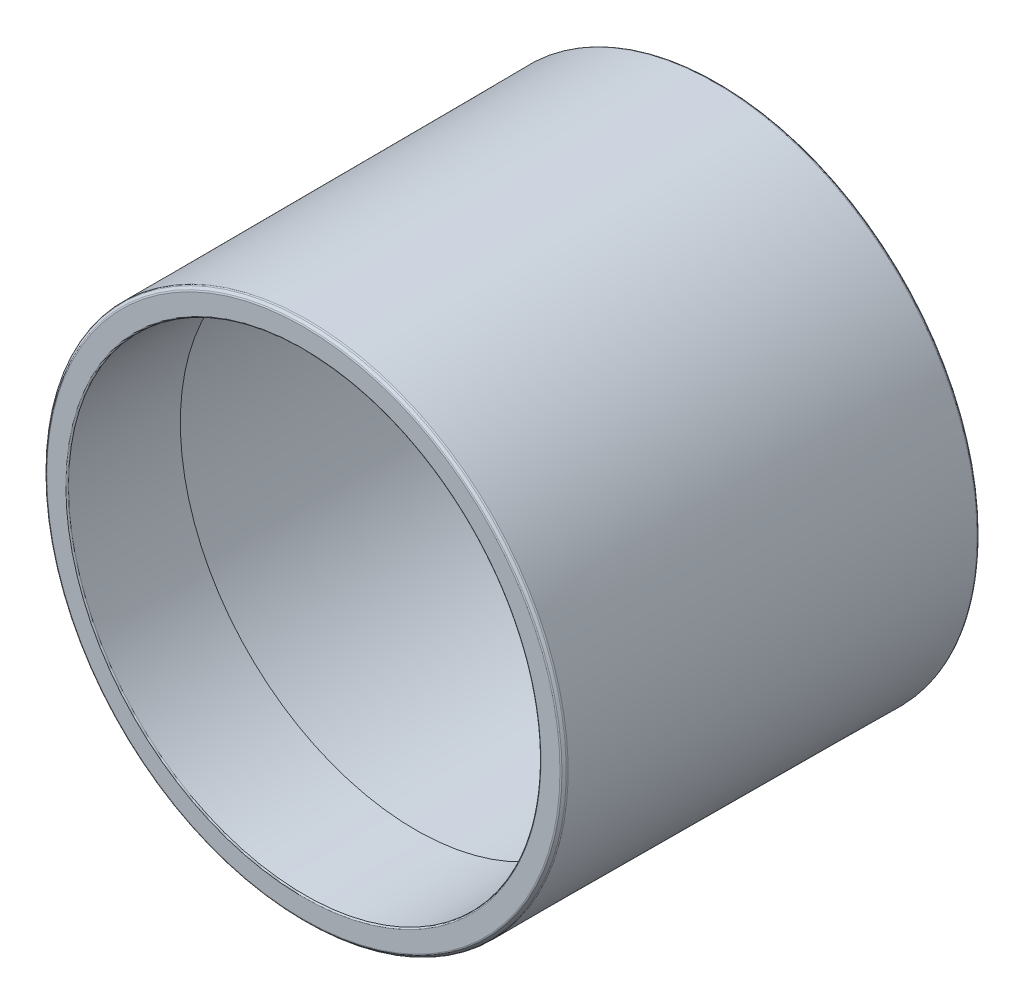
ISO-10303-21;
HEADER;
FILE_DESCRIPTION(('STEP AP214'),'2;1');
FILE_NAME('part.step','',(''),(''),'','','');
FILE_SCHEMA(('AUTOMOTIVE_DESIGN { 1 0 10303 214 1 1 1 1 }'));
ENDSEC;
DATA;
#1=APPLICATION_CONTEXT('core data for automotive mechanical design processes');
#2=APPLICATION_PROTOCOL_DEFINITION('international standard','automotive_design',2000,#1);
#3=PRODUCT_CONTEXT('',#1,'mechanical');
#4=PRODUCT('Part','Part','',(#3));
#5=PRODUCT_RELATED_PRODUCT_CATEGORY('part','',(#4));
#6=PRODUCT_DEFINITION_FORMATION('','',#4);
#7=PRODUCT_DEFINITION_CONTEXT('part definition',#1,'design');
#8=PRODUCT_DEFINITION('design','',#6,#7);
#9=PRODUCT_DEFINITION_SHAPE('','',#8);
#10=(LENGTH_UNIT() NAMED_UNIT(*) SI_UNIT(.MILLI.,.METRE.));
#11=(NAMED_UNIT(*) PLANE_ANGLE_UNIT() SI_UNIT($,.RADIAN.));
#12=(NAMED_UNIT(*) SI_UNIT($,.STERADIAN.) SOLID_ANGLE_UNIT());
#13=UNCERTAINTY_MEASURE_WITH_UNIT(LENGTH_MEASURE(1.E-05),#10,'distance_accuracy_value','');
#14=(GEOMETRIC_REPRESENTATION_CONTEXT(3) GLOBAL_UNCERTAINTY_ASSIGNED_CONTEXT((#13)) GLOBAL_UNIT_ASSIGNED_CONTEXT((#10,
#11,#12)) REPRESENTATION_CONTEXT('',''));
#15=CARTESIAN_POINT('',(0.,0.,0.));
#16=DIRECTION('',(0.,0.,1.));
#17=DIRECTION('',(1.,0.,0.));
#18=AXIS2_PLACEMENT_3D('',#15,#16,#17);
#19=CARTESIAN_POINT('',(0.,0.,7.25));
#20=DIRECTION('',(0.,0.,1.));
#21=DIRECTION('',(1.,0.,0.));
#22=AXIS2_PLACEMENT_3D('',#19,#20,#21);
#23=CONICAL_SURFACE('',#22,17.825,0.00872664625997167);
#24=CARTESIAN_POINT('',(0.,0.,15.6508726535503));
#25=DIRECTION('',(0.,0.,-1.));
#26=DIRECTION('',(-1.,0.,0.));
#27=AXIS2_PLACEMENT_3D('',#24,#25,#26);
#28=CIRCLE('',#27,17.8983133049745);
#29=CARTESIAN_POINT('',(-17.8983133049745,0.,15.6508726535503));
#30=VERTEX_POINT('',#29);
#31=EDGE_CURVE('E117',#30,#30,#28,.F.);
#32=ORIENTED_EDGE('',*,*,#31,.T.);
#33=EDGE_LOOP('',(#32));
#34=FACE_BOUND('',#33,.T.);
#35=CARTESIAN_POINT('',(0.,0.,7.25));
#36=DIRECTION('',(0.,0.,1.));
#37=DIRECTION('',(1.,0.,0.));
#38=AXIS2_PLACEMENT_3D('',#35,#36,#37);
#39=CIRCLE('',#38,17.825);
#40=CARTESIAN_POINT('',(17.825,0.,7.25));
#41=VERTEX_POINT('',#40);
#42=EDGE_CURVE('E149',#41,#41,#39,.T.);
#43=ORIENTED_EDGE('',*,*,#42,.F.);
#44=EDGE_LOOP('',(#43));
#45=FACE_BOUND('',#44,.T.);
#46=ADVANCED_FACE('F49',(#34,#45),#23,.F.);
#47=CARTESIAN_POINT('',(0.,0.,-11.75));
#48=DIRECTION('',(0.,0.,-1.));
#49=DIRECTION('',(-1.,0.,0.));
#50=AXIS2_PLACEMENT_3D('',#47,#48,#49);
#51=CONICAL_SURFACE('',#50,18.5264374569649,0.00872664625997305);
#52=CARTESIAN_POINT('',(0.,0.,-14.014126566416));
#53=DIRECTION('',(0.,0.,1.));
#54=DIRECTION('',(1.,0.,0.));
#55=AXIS2_PLACEMENT_3D('',#52,#53,#54);
#56=CIRCLE('',#55,18.5461961901716);
#57=CARTESIAN_POINT('',(18.5461961901716,0.,-14.014126566416));
#58=VERTEX_POINT('',#57);
#59=EDGE_CURVE('E12',#58,#58,#56,.F.);
#60=ORIENTED_EDGE('',*,*,#59,.T.);
#61=EDGE_LOOP('',(#60));
#62=FACE_BOUND('',#61,.T.);
#63=CARTESIAN_POINT('',(0.,0.,-12.75));
#64=DIRECTION('',(0.,0.,1.));
#65=DIRECTION('',(1.,0.,0.));
#66=AXIS2_PLACEMENT_3D('',#63,#64,#65);
#67=CIRCLE('',#66,18.5351643247557);
#68=CARTESIAN_POINT('',(18.5351643247557,0.,-12.75));
#69=VERTEX_POINT('',#68);
#70=EDGE_CURVE('E122',#69,#69,#67,.F.);
#71=ORIENTED_EDGE('',*,*,#70,.F.);
#72=EDGE_LOOP('',(#71));
#73=FACE_BOUND('',#72,.T.);
#74=ADVANCED_FACE('F158',(#62,#73),#51,.F.);
#75=CARTESIAN_POINT('',(0.,0.,-14.0405746064233));
#76=DIRECTION('',(0.,0.,-1.));
#77=DIRECTION('',(-1.,0.,0.));
#78=AXIS2_PLACEMENT_3D('',#75,#76,#77);
#79=CONICAL_SURFACE('',#78,18.5464269987201,0.357792496658831);
#80=CARTESIAN_POINT('',(0.,0.,-14.4191211323186));
#81=DIRECTION('',(0.,0.,1.));
#82=DIRECTION('',(1.,0.,0.));
#83=AXIS2_PLACEMENT_3D('',#80,#81,#82);
#84=CIRCLE('',#83,18.6879597452246);
#85=CARTESIAN_POINT('',(18.6879597452246,0.,-14.4191211323186));
#86=VERTEX_POINT('',#85);
#87=EDGE_CURVE('E85',#86,#86,#84,.F.);
#88=ORIENTED_EDGE('',*,*,#87,.T.);
#89=EDGE_LOOP('',(#88));
#90=FACE_BOUND('',#89,.T.);
#91=CARTESIAN_POINT('',(0.,0.,-14.0653486932798));
#92=DIRECTION('',(0.,0.,1.));
#93=DIRECTION('',(1.,0.,0.));
#94=AXIS2_PLACEMENT_3D('',#91,#92,#93);
#95=CIRCLE('',#94,18.555689650244);
#96=CARTESIAN_POINT('',(18.555689650244,0.,-14.0653486932798));
#97=VERTEX_POINT('',#96);
#98=EDGE_CURVE('E89',#97,#97,#95,.T.);
#99=ORIENTED_EDGE('',*,*,#98,.T.);
#100=EDGE_LOOP('',(#99));
#101=FACE_BOUND('',#100,.T.);
#102=ADVANCED_FACE('F165',(#90,#101),#79,.F.);
#103=CARTESIAN_POINT('',(0.,0.,-14.4513089803248));
#104=DIRECTION('',(0.,0.,-1.));
#105=DIRECTION('',(-1.,0.,0.));
#106=AXIS2_PLACEMENT_3D('',#103,#104,#105);
#107=CONICAL_SURFACE('',#106,18.6999942884596,1.56206968053494);
#108=CARTESIAN_POINT('',(0.,0.,-14.4516088594089));
#109=DIRECTION('',(0.,0.,1.));
#110=DIRECTION('',(1.,0.,0.));
#111=AXIS2_PLACEMENT_3D('',#108,#109,#110);
#112=CIRCLE('',#111,18.7343570279121);
#113=CARTESIAN_POINT('',(18.7343570279121,0.,-14.4516088594089));
#114=VERTEX_POINT('',#113);
#115=EDGE_CURVE('E93',#114,#114,#112,.T.);
#116=ORIENTED_EDGE('',*,*,#115,.T.);
#117=EDGE_LOOP('',(#116));
#118=FACE_BOUND('',#117,.T.);
#119=CARTESIAN_POINT('',(0.,0.,-14.4534071987484));
#120=DIRECTION('',(0.,0.,1.));
#121=DIRECTION('',(1.,0.,0.));
#122=AXIS2_PLACEMENT_3D('',#119,#120,#121);
#123=CIRCLE('',#122,18.9404263053061);
#124=CARTESIAN_POINT('',(18.9404263053061,0.,-14.4534071987484));
#125=VERTEX_POINT('',#124);
#126=EDGE_CURVE('E121',#125,#125,#123,.T.);
#127=ORIENTED_EDGE('',*,*,#126,.F.);
#128=EDGE_LOOP('',(#127));
#129=FACE_BOUND('',#128,.T.);
#130=ADVANCED_FACE('F240',(#118,#129),#107,.F.);
#131=CARTESIAN_POINT('',(0.,0.,-14.5534033910549));
#132=DIRECTION('',(0.,0.,1.));
#133=DIRECTION('',(1.,0.,0.));
#134=AXIS2_PLACEMENT_3D('',#131,#132,#133);
#135=TOROIDAL_SURFACE('',#134,18.9395536517563,0.100000000000001);
#136=CARTESIAN_POINT('',(0.,0.,-14.552530737505));
#137=DIRECTION('',(0.,0.,1.));
#138=DIRECTION('',(1.,0.,0.));
#139=AXIS2_PLACEMENT_3D('',#136,#137,#138);
#140=CIRCLE('',#139,19.0395498440627);
#141=CARTESIAN_POINT('',(19.0395498440627,0.,-14.552530737505));
#142=VERTEX_POINT('',#141);
#143=EDGE_CURVE('E126',#142,#142,#140,.T.);
#144=ORIENTED_EDGE('',*,*,#143,.F.);
#145=EDGE_LOOP('',(#144));
#146=FACE_BOUND('',#145,.T.);
#147=ORIENTED_EDGE('',*,*,#126,.T.);
#148=EDGE_LOOP('',(#147));
#149=FACE_BOUND('',#148,.T.);
#150=ADVANCED_FACE('F236',(#146,#149),#135,.F.);
#151=CARTESIAN_POINT('',(0.,0.,-14.552530737505));
#152=DIRECTION('',(0.,0.,-1.));
#153=DIRECTION('',(-1.,0.,0.));
#154=AXIS2_PLACEMENT_3D('',#151,#152,#153);
#155=CONICAL_SURFACE('',#154,19.0395498440627,0.00872664625997315);
#156=CARTESIAN_POINT('',(0.,0.,-15.6508726535503));
#157=DIRECTION('',(0.,0.,1.));
#158=DIRECTION('',(1.,0.,0.));
#159=AXIS2_PLACEMENT_3D('',#156,#157,#158);
#160=CIRCLE('',#159,19.0491349287531);
#161=CARTESIAN_POINT('',(19.0491349287531,0.,-15.6508726535503));
#162=VERTEX_POINT('',#161);
#163=EDGE_CURVE('E97',#162,#162,#160,.F.);
#164=ORIENTED_EDGE('',*,*,#163,.T.);
#165=EDGE_LOOP('',(#164));
#166=FACE_BOUND('',#165,.T.);
#167=ORIENTED_EDGE('',*,*,#143,.T.);
#168=EDGE_LOOP('',(#167));
#169=FACE_BOUND('',#168,.T.);
#170=ADVANCED_FACE('F229',(#166,#169),#155,.F.);
#171=CARTESIAN_POINT('',(0.,19.8599561894701,-15.75));
#172=DIRECTION('',(0.,0.,1.));
#173=DIRECTION('',(1.,0.,0.));
#174=AXIS2_PLACEMENT_3D('',#171,#172,#173);
#175=PLANE('',#174);
#176=CARTESIAN_POINT('',(0.,0.,-15.75));
#177=DIRECTION('',(0.,0.,1.));
#178=DIRECTION('',(1.,0.,0.));
#179=AXIS2_PLACEMENT_3D('',#176,#177,#178);
#180=CIRCLE('',#179,19.1491311210595);
#181=CARTESIAN_POINT('',(19.1491311210595,0.,-15.75));
#182=VERTEX_POINT('',#181);
#183=EDGE_CURVE('E101',#182,#182,#180,.T.);
#184=ORIENTED_EDGE('',*,*,#183,.T.);
#185=EDGE_LOOP('',(#184));
#186=FACE_BOUND('',#185,.T.);
#187=CARTESIAN_POINT('',(0.,0.,-15.75));
#188=DIRECTION('',(0.,0.,1.));
#189=DIRECTION('',(1.,0.,0.));
#190=AXIS2_PLACEMENT_3D('',#187,#188,#189);
#191=CIRCLE('',#190,19.5467965498247);
#192=CARTESIAN_POINT('',(19.5467965498247,0.,-15.75));
#193=VERTEX_POINT('',#192);
#194=EDGE_CURVE('E105',#193,#193,#191,.F.);
#195=ORIENTED_EDGE('',*,*,#194,.T.);
#196=EDGE_LOOP('',(#195));
#197=FACE_BOUND('',#196,.T.);
#198=ADVANCED_FACE('F219',(#186,#197),#175,.F.);
#199=CARTESIAN_POINT('',(0.,0.,-15.75));
#200=DIRECTION('',(0.,0.,-1.));
#201=DIRECTION('',(-1.,0.,0.));
#202=AXIS2_PLACEMENT_3D('',#199,#200,#201);
#203=CONICAL_SURFACE('',#202,19.8599561894701,0.00349065850398269);
#204=CARTESIAN_POINT('',(0.,0.,15.4388943092487));
#205=DIRECTION('',(0.,0.,-1.));
#206=DIRECTION('',(-1.,0.,0.));
#207=AXIS2_PLACEMENT_3D('',#204,#205,#206);
#208=CIRCLE('',#207,19.7510859681358);
#209=CARTESIAN_POINT('',(-19.7510859681358,0.,15.4388943092487));
#210=VERTEX_POINT('',#209);
#211=EDGE_CURVE('E77',#210,#210,#208,.T.);
#212=ORIENTED_EDGE('',*,*,#211,.T.);
#213=EDGE_LOOP('',(#212));
#214=FACE_BOUND('',#213,.T.);
#215=CARTESIAN_POINT('',(0.,0.,-15.4368422682303));
#216=DIRECTION('',(0.,0.,-1.));
#217=DIRECTION('',(-1.,0.,0.));
#218=AXIS2_PLACEMENT_3D('',#215,#216,#217);
#219=CIRCLE('',#218,19.8588630583308);
#220=CARTESIAN_POINT('',(-19.8588630583308,0.,-15.4368422682303));
#221=VERTEX_POINT('',#220);
#222=EDGE_CURVE('E81',#221,#221,#219,.F.);
#223=ORIENTED_EDGE('',*,*,#222,.T.);
#224=EDGE_LOOP('',(#223));
#225=FACE_BOUND('',#224,.T.);
#226=ADVANCED_FACE('F216',(#214,#225),#203,.T.);
#227=CARTESIAN_POINT('',(0.,17.825,15.75));
#228=DIRECTION('',(0.,0.,-1.));
#229=DIRECTION('',(-1.,0.,0.));
#230=AXIS2_PLACEMENT_3D('',#227,#228,#229);
#231=PLANE('',#230);
#232=CARTESIAN_POINT('',(0.,0.,15.75));
#233=DIRECTION('',(0.,0.,-1.));
#234=DIRECTION('',(-1.,0.,0.));
#235=AXIS2_PLACEMENT_3D('',#232,#233,#234);
#236=CIRCLE('',#235,17.998309497281);
#237=CARTESIAN_POINT('',(-17.998309497281,0.,15.75));
#238=VERTEX_POINT('',#237);
#239=EDGE_CURVE('E109',#238,#238,#236,.T.);
#240=ORIENTED_EDGE('',*,*,#239,.T.);
#241=EDGE_LOOP('',(#240));
#242=FACE_BOUND('',#241,.T.);
#243=CARTESIAN_POINT('',(0.,0.,15.75));
#244=DIRECTION('',(0.,0.,-1.));
#245=DIRECTION('',(-1.,0.,0.));
#246=AXIS2_PLACEMENT_3D('',#243,#244,#245);
#247=CIRCLE('',#246,19.4388924138748);
#248=CARTESIAN_POINT('',(-19.4388924138748,0.,15.75));
#249=VERTEX_POINT('',#248);
#250=EDGE_CURVE('E113',#249,#249,#247,.F.);
#251=ORIENTED_EDGE('',*,*,#250,.T.);
#252=EDGE_LOOP('',(#251));
#253=FACE_BOUND('',#252,.T.);
#254=ADVANCED_FACE('F218',(#242,#253),#231,.F.);
#255=CARTESIAN_POINT('',(0.,0.,-12.75));
#256=DIRECTION('',(0.,0.,1.));
#257=DIRECTION('',(1.,0.,0.));
#258=AXIS2_PLACEMENT_3D('',#255,#256,#257);
#259=PLANE('',#258);
#260=CARTESIAN_POINT('',(0.,0.,-12.75));
#261=DIRECTION('',(0.,0.,1.));
#262=DIRECTION('',(1.,0.,0.));
#263=AXIS2_PLACEMENT_3D('',#260,#261,#262);
#264=CIRCLE('',#263,18.675);
#265=CARTESIAN_POINT('',(18.675,0.,-12.75));
#266=VERTEX_POINT('',#265);
#267=EDGE_CURVE('E127',#266,#266,#264,.T.);
#268=ORIENTED_EDGE('',*,*,#267,.T.);
#269=EDGE_LOOP('',(#268));
#270=FACE_BOUND('',#269,.T.);
#271=ORIENTED_EDGE('',*,*,#70,.T.);
#272=EDGE_LOOP('',(#271));
#273=FACE_BOUND('',#272,.T.);
#274=ADVANCED_FACE('F226',(#270,#273),#259,.T.);
#275=CARTESIAN_POINT('',(0.,0.,-12.4));
#276=DIRECTION('',(0.,0.,1.));
#277=DIRECTION('',(1.,0.,0.));
#278=AXIS2_PLACEMENT_3D('',#275,#276,#277);
#279=TOROIDAL_SURFACE('',#278,18.675,0.35);
#280=CARTESIAN_POINT('',(0.,0.,-12.4));
#281=DIRECTION('',(0.,0.,1.));
#282=DIRECTION('',(1.,0.,0.));
#283=AXIS2_PLACEMENT_3D('',#280,#281,#282);
#284=CIRCLE('',#283,19.025);
#285=CARTESIAN_POINT('',(19.025,0.,-12.4));
#286=VERTEX_POINT('',#285);
#287=EDGE_CURVE('E137',#286,#286,#284,.T.);
#288=ORIENTED_EDGE('',*,*,#287,.T.);
#289=EDGE_LOOP('',(#288));
#290=FACE_BOUND('',#289,.T.);
#291=ORIENTED_EDGE('',*,*,#267,.F.);
#292=EDGE_LOOP('',(#291));
#293=FACE_BOUND('',#292,.T.);
#294=ADVANCED_FACE('F303',(#290,#293),#279,.F.);
#295=CARTESIAN_POINT('',(0.,0.,8.95442332719835));
#296=DIRECTION('',(0.,0.,1.));
#297=DIRECTION('',(1.,0.,0.));
#298=AXIS2_PLACEMENT_3D('',#295,#296,#297);
#299=CYLINDRICAL_SURFACE('',#298,19.025);
#300=CARTESIAN_POINT('',(0.,0.,6.9));
#301=DIRECTION('',(0.,0.,1.));
#302=DIRECTION('',(1.,0.,0.));
#303=AXIS2_PLACEMENT_3D('',#300,#301,#302);
#304=CIRCLE('',#303,19.025);
#305=CARTESIAN_POINT('',(19.025,0.,6.9));
#306=VERTEX_POINT('',#305);
#307=EDGE_CURVE('E141',#306,#306,#304,.T.);
#308=ORIENTED_EDGE('',*,*,#307,.T.);
#309=EDGE_LOOP('',(#308));
#310=FACE_BOUND('',#309,.T.);
#311=ORIENTED_EDGE('',*,*,#287,.F.);
#312=EDGE_LOOP('',(#311));
#313=FACE_BOUND('',#312,.T.);
#314=ADVANCED_FACE('F312',(#310,#313),#299,.F.);
#315=CARTESIAN_POINT('',(0.,0.,6.9));
#316=DIRECTION('',(0.,0.,1.));
#317=DIRECTION('',(1.,0.,0.));
#318=AXIS2_PLACEMENT_3D('',#315,#316,#317);
#319=TOROIDAL_SURFACE('',#318,18.675,0.349999999999996);
#320=CARTESIAN_POINT('',(0.,0.,7.25));
#321=DIRECTION('',(0.,0.,1.));
#322=DIRECTION('',(1.,0.,0.));
#323=AXIS2_PLACEMENT_3D('',#320,#321,#322);
#324=CIRCLE('',#323,18.675);
#325=CARTESIAN_POINT('',(18.675,0.,7.25));
#326=VERTEX_POINT('',#325);
#327=EDGE_CURVE('E145',#326,#326,#324,.T.);
#328=ORIENTED_EDGE('',*,*,#327,.T.);
#329=EDGE_LOOP('',(#328));
#330=FACE_BOUND('',#329,.T.);
#331=ORIENTED_EDGE('',*,*,#307,.F.);
#332=EDGE_LOOP('',(#331));
#333=FACE_BOUND('',#332,.T.);
#334=ADVANCED_FACE('F322',(#330,#333),#319,.F.);
#335=CARTESIAN_POINT('',(0.,0.,7.25));
#336=DIRECTION('',(0.,0.,-1.));
#337=DIRECTION('',(-1.,0.,0.));
#338=AXIS2_PLACEMENT_3D('',#335,#336,#337);
#339=PLANE('',#338);
#340=ORIENTED_EDGE('',*,*,#42,.T.);
#341=EDGE_LOOP('',(#340));
#342=FACE_BOUND('',#341,.T.);
#343=ORIENTED_EDGE('',*,*,#327,.F.);
#344=EDGE_LOOP('',(#343));
#345=FACE_BOUND('',#344,.T.);
#346=ADVANCED_FACE('F154',(#342,#345),#339,.T.);
#347=CARTESIAN_POINT('',(0.,0.,-15.4991273371462));
#348=DIRECTION('',(0.,0.,1.));
#349=DIRECTION('',(1.,0.,0.));
#350=AXIS2_PLACEMENT_3D('',#347,#348,#349);
#351=CONICAL_SURFACE('',#350,19.8590804751193,0.783652834145449);
#352=CARTESIAN_POINT('',(0.,0.,-15.7058807356018));
#353=DIRECTION('',(0.,0.,1.));
#354=DIRECTION('',(1.,0.,0.));
#355=AXIS2_PLACEMENT_3D('',#352,#353,#354);
#356=CIRCLE('',#355,19.6530475254834);
#357=CARTESIAN_POINT('',(19.6530475254834,0.,-15.7058807356018));
#358=VERTEX_POINT('',#357);
#359=EDGE_CURVE('E57',#358,#358,#356,.T.);
#360=ORIENTED_EDGE('',*,*,#359,.T.);
#361=EDGE_LOOP('',(#360));
#362=FACE_BOUND('',#361,.T.);
#363=CARTESIAN_POINT('',(0.,0.,-15.5432466015444));
#364=DIRECTION('',(0.,0.,1.));
#365=DIRECTION('',(1.,0.,0.));
#366=AXIS2_PLACEMENT_3D('',#363,#364,#365);
#367=CIRCLE('',#366,19.8151149478408);
#368=CARTESIAN_POINT('',(19.8151149478408,0.,-15.5432466015444));
#369=VERTEX_POINT('',#368);
#370=EDGE_CURVE('E62',#369,#369,#367,.F.);
#371=ORIENTED_EDGE('',*,*,#370,.T.);
#372=EDGE_LOOP('',(#371));
#373=FACE_BOUND('',#372,.T.);
#374=ADVANCED_FACE('F170',(#362,#373),#351,.T.);
#375=CARTESIAN_POINT('',(0.,0.,15.75));
#376=DIRECTION('',(0.,0.,-1.));
#377=DIRECTION('',(-1.,0.,0.));
#378=AXIS2_PLACEMENT_3D('',#375,#376,#377);
#379=CONICAL_SURFACE('',#378,19.5008711450756,0.787143492649433);
#380=CARTESIAN_POINT('',(0.,0.,15.5446216871951));
#381=DIRECTION('',(0.,0.,-1.));
#382=DIRECTION('',(-1.,0.,0.));
#383=AXIS2_PLACEMENT_3D('',#380,#381,#382);
#384=CIRCLE('',#383,19.7069676175889);
#385=CARTESIAN_POINT('',(-19.7069676175889,0.,15.5446216871951));
#386=VERTEX_POINT('',#385);
#387=EDGE_CURVE('E67',#386,#386,#384,.F.);
#388=ORIENTED_EDGE('',*,*,#387,.T.);
#389=EDGE_LOOP('',(#388));
#390=FACE_BOUND('',#389,.T.);
#391=CARTESIAN_POINT('',(0.,0.,15.7062509756587));
#392=DIRECTION('',(0.,0.,-1.));
#393=DIRECTION('',(-1.,0.,0.));
#394=AXIS2_PLACEMENT_3D('',#391,#392,#393);
#395=CIRCLE('',#394,19.5447731494767);
#396=CARTESIAN_POINT('',(-19.5447731494767,0.,15.7062509756587));
#397=VERTEX_POINT('',#396);
#398=EDGE_CURVE('E73',#397,#397,#395,.T.);
#399=ORIENTED_EDGE('',*,*,#398,.T.);
#400=EDGE_LOOP('',(#399));
#401=FACE_BOUND('',#400,.T.);
#402=ADVANCED_FACE('F176',(#390,#401),#379,.T.);
#403=CARTESIAN_POINT('',(0.,0.,15.65));
#404=DIRECTION('',(0.,0.,-1.));
#405=DIRECTION('',(-1.,0.,0.));
#406=AXIS2_PLACEMENT_3D('',#403,#404,#405);
#407=TOROIDAL_SURFACE('',#406,17.998309497281,0.1);
#408=ORIENTED_EDGE('',*,*,#239,.F.);
#409=EDGE_LOOP('',(#408));
#410=FACE_BOUND('',#409,.T.);
#411=ORIENTED_EDGE('',*,*,#31,.F.);
#412=EDGE_LOOP('',(#411));
#413=FACE_BOUND('',#412,.T.);
#414=ADVANCED_FACE('F181',(#410,#413),#407,.T.);
#415=CARTESIAN_POINT('',(0.,0.,-15.65));
#416=DIRECTION('',(0.,0.,1.));
#417=DIRECTION('',(1.,0.,0.));
#418=AXIS2_PLACEMENT_3D('',#415,#416,#417);
#419=TOROIDAL_SURFACE('',#418,19.1491311210595,0.1);
#420=ORIENTED_EDGE('',*,*,#163,.F.);
#421=EDGE_LOOP('',(#420));
#422=FACE_BOUND('',#421,.T.);
#423=ORIENTED_EDGE('',*,*,#183,.F.);
#424=EDGE_LOOP('',(#423));
#425=FACE_BOUND('',#424,.T.);
#426=ADVANCED_FACE('F185',(#422,#425),#419,.T.);
#427=CARTESIAN_POINT('',(0.,0.,-14.4016107632557));
#428=DIRECTION('',(0.,0.,-1.));
#429=DIRECTION('',(-1.,0.,0.));
#430=AXIS2_PLACEMENT_3D('',#427,#428,#429);
#431=TOROIDAL_SURFACE('',#430,18.734793354687,0.05);
#432=ORIENTED_EDGE('',*,*,#87,.F.);
#433=EDGE_LOOP('',(#432));
#434=FACE_BOUND('',#433,.T.);
#435=ORIENTED_EDGE('',*,*,#115,.F.);
#436=EDGE_LOOP('',(#435));
#437=FACE_BOUND('',#436,.T.);
#438=ADVANCED_FACE('F189',(#434,#437),#431,.T.);
#439=CARTESIAN_POINT('',(0.,0.,15.4383707115364));
#440=DIRECTION('',(0.,0.,1.));
#441=DIRECTION('',(1.,0.,0.));
#442=AXIS2_PLACEMENT_3D('',#439,#440,#441);
#443=TOROIDAL_SURFACE('',#442,19.6010868819871,0.15);
#444=ORIENTED_EDGE('',*,*,#387,.F.);
#445=EDGE_LOOP('',(#444));
#446=FACE_BOUND('',#445,.T.);
#447=ORIENTED_EDGE('',*,*,#211,.F.);
#448=EDGE_LOOP('',(#447));
#449=FACE_BOUND('',#448,.T.);
#450=ADVANCED_FACE('F193',(#446,#449),#443,.T.);
#451=CARTESIAN_POINT('',(0.,0.,15.6));
#452=DIRECTION('',(0.,0.,-1.));
#453=DIRECTION('',(-1.,0.,0.));
#454=AXIS2_PLACEMENT_3D('',#451,#452,#453);
#455=TOROIDAL_SURFACE('',#454,19.4388924138748,0.15);
#456=ORIENTED_EDGE('',*,*,#398,.F.);
#457=EDGE_LOOP('',(#456));
#458=FACE_BOUND('',#457,.T.);
#459=ORIENTED_EDGE('',*,*,#250,.F.);
#460=EDGE_LOOP('',(#459));
#461=FACE_BOUND('',#460,.T.);
#462=ADVANCED_FACE('F197',(#458,#461),#455,.T.);
#463=CARTESIAN_POINT('',(0.,0.,-15.6));
#464=DIRECTION('',(0.,0.,1.));
#465=DIRECTION('',(1.,0.,0.));
#466=AXIS2_PLACEMENT_3D('',#463,#464,#465);
#467=TOROIDAL_SURFACE('',#466,19.5467965498247,0.15);
#468=ORIENTED_EDGE('',*,*,#359,.F.);
#469=EDGE_LOOP('',(#468));
#470=FACE_BOUND('',#469,.T.);
#471=ORIENTED_EDGE('',*,*,#194,.F.);
#472=EDGE_LOOP('',(#471));
#473=FACE_BOUND('',#472,.T.);
#474=ADVANCED_FACE('F201',(#470,#473),#467,.T.);
#475=CARTESIAN_POINT('',(0.,0.,-15.4373658659426));
#476=DIRECTION('',(0.,0.,-1.));
#477=DIRECTION('',(-1.,0.,0.));
#478=AXIS2_PLACEMENT_3D('',#475,#476,#477);
#479=TOROIDAL_SURFACE('',#478,19.7088639721821,0.15);
#480=ORIENTED_EDGE('',*,*,#370,.F.);
#481=EDGE_LOOP('',(#480));
#482=FACE_BOUND('',#481,.T.);
#483=ORIENTED_EDGE('',*,*,#222,.F.);
#484=EDGE_LOOP('',(#483));
#485=FACE_BOUND('',#484,.T.);
#486=ADVANCED_FACE('F204',(#482,#485),#479,.T.);
#487=CARTESIAN_POINT('',(0.,0.,-14.0128175860909));
#488=DIRECTION('',(0.,0.,-1.));
#489=DIRECTION('',(-1.,0.,0.));
#490=AXIS2_PLACEMENT_3D('',#487,#488,#489);
#491=TOROIDAL_SURFACE('',#490,18.6961904786312,0.15);
#492=ORIENTED_EDGE('',*,*,#59,.F.);
#493=EDGE_LOOP('',(#492));
#494=FACE_BOUND('',#493,.T.);
#495=ORIENTED_EDGE('',*,*,#98,.F.);
#496=EDGE_LOOP('',(#495));
#497=FACE_BOUND('',#496,.T.);
#498=ADVANCED_FACE('F51',(#494,#497),#491,.T.);
#499=CLOSED_SHELL('',(#46,#74,#102,#130,#150,#170,#198,#226,#254,#274,#294,#314,#334,#346,#374,
#402,#414,#426,#438,#450,#462,#474,#486,#498));
#500=MANIFOLD_SOLID_BREP('B2',#499);
#501=ADVANCED_BREP_SHAPE_REPRESENTATION('',(#18,#500),#14);
#502=SHAPE_DEFINITION_REPRESENTATION(#9,#501);
ENDSEC;
END-ISO-10303-21;
